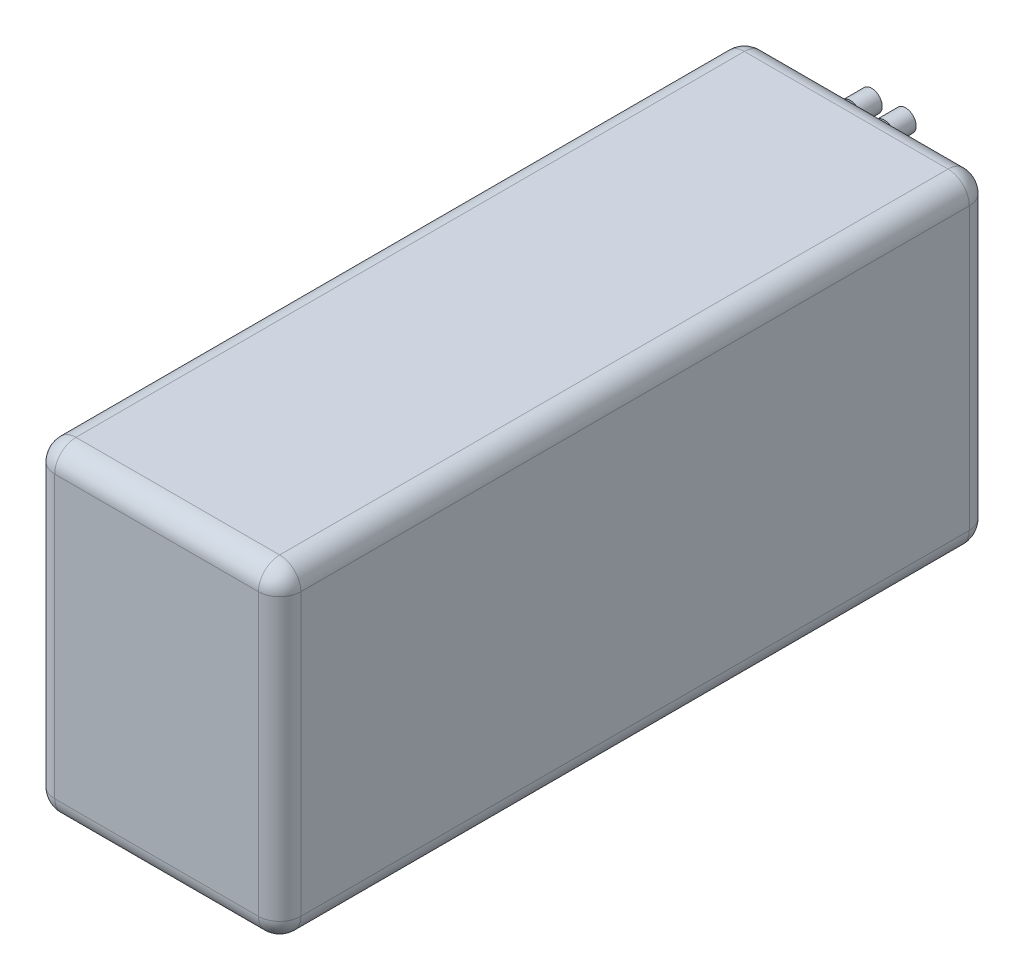
ISO-10303-21;
HEADER;
FILE_DESCRIPTION(('STEP AP214'),'2;1');
FILE_NAME('part.step','',(''),(''),'','','');
FILE_SCHEMA(('AUTOMOTIVE_DESIGN { 1 0 10303 214 1 1 1 1 }'));
ENDSEC;
DATA;
#1=APPLICATION_CONTEXT('core data for automotive mechanical design processes');
#2=APPLICATION_PROTOCOL_DEFINITION('international standard','automotive_design',2000,#1);
#3=PRODUCT_CONTEXT('',#1,'mechanical');
#4=PRODUCT('Part','Part','',(#3));
#5=PRODUCT_RELATED_PRODUCT_CATEGORY('part','',(#4));
#6=PRODUCT_DEFINITION_FORMATION('','',#4);
#7=PRODUCT_DEFINITION_CONTEXT('part definition',#1,'design');
#8=PRODUCT_DEFINITION('design','',#6,#7);
#9=PRODUCT_DEFINITION_SHAPE('','',#8);
#10=(LENGTH_UNIT() NAMED_UNIT(*) SI_UNIT(.MILLI.,.METRE.));
#11=(NAMED_UNIT(*) PLANE_ANGLE_UNIT() SI_UNIT($,.RADIAN.));
#12=(NAMED_UNIT(*) SI_UNIT($,.STERADIAN.) SOLID_ANGLE_UNIT());
#13=UNCERTAINTY_MEASURE_WITH_UNIT(LENGTH_MEASURE(1.E-05),#10,'distance_accuracy_value','');
#14=(GEOMETRIC_REPRESENTATION_CONTEXT(3) GLOBAL_UNCERTAINTY_ASSIGNED_CONTEXT((#13)) GLOBAL_UNIT_ASSIGNED_CONTEXT((#10,
#11,#12)) REPRESENTATION_CONTEXT('',''));
#15=CARTESIAN_POINT('',(0.,0.,0.));
#16=DIRECTION('',(0.,0.,1.));
#17=DIRECTION('',(1.,0.,0.));
#18=AXIS2_PLACEMENT_3D('',#15,#16,#17);
#19=CARTESIAN_POINT('',(-11.6,30.5,-33.5));
#20=DIRECTION('',(0.,0.,1.));
#21=DIRECTION('',(1.,0.,0.));
#22=AXIS2_PLACEMENT_3D('',#19,#20,#21);
#23=PLANE('',#22);
#24=CARTESIAN_POINT('',(-0.600000000000003,4.69826840522755,-33.5));
#25=DIRECTION('',(0.,0.,1.));
#26=DIRECTION('',(1.,0.,0.));
#27=AXIS2_PLACEMENT_3D('',#24,#25,#26);
#28=CIRCLE('',#27,0.5);
#29=CARTESIAN_POINT('',(-0.100000000000003,4.69826840522755,-33.5));
#30=VERTEX_POINT('',#29);
#31=EDGE_CURVE('E44',#30,#30,#28,.F.);
#32=ORIENTED_EDGE('',*,*,#31,.F.);
#33=EDGE_LOOP('',(#32));
#34=FACE_BOUND('',#33,.T.);
#35=CARTESIAN_POINT('',(0.599999999999996,4.69826840522755,-33.5));
#36=DIRECTION('',(0.,0.,1.));
#37=DIRECTION('',(1.,0.,0.));
#38=AXIS2_PLACEMENT_3D('',#35,#36,#37);
#39=CIRCLE('',#38,0.500000000000001);
#40=CARTESIAN_POINT('',(1.1,4.69826840522755,-33.5));
#41=VERTEX_POINT('',#40);
#42=EDGE_CURVE('E221',#41,#41,#39,.F.);
#43=ORIENTED_EDGE('',*,*,#42,.F.);
#44=EDGE_LOOP('',(#43));
#45=FACE_BOUND('',#44,.T.);
#46=CARTESIAN_POINT('',(-1.6,28.5,-33.5));
#47=DIRECTION('',(0.,0.,-1.));
#48=DIRECTION('',(-1.,0.,0.));
#49=AXIS2_PLACEMENT_3D('',#46,#47,#48);
#50=CIRCLE('',#49,1.);
#51=CARTESIAN_POINT('',(-0.600000000000002,28.5,-33.5));
#52=VERTEX_POINT('',#51);
#53=CARTESIAN_POINT('',(-2.6,28.5,-33.5));
#54=VERTEX_POINT('',#53);
#55=EDGE_CURVE('E144',#52,#54,#50,.T.);
#56=ORIENTED_EDGE('',*,*,#55,.F.);
#57=DIRECTION('',(-1.,0.,0.));
#58=VECTOR('',#57,1.);
#59=CARTESIAN_POINT('',(11.6,28.5,-33.5));
#60=LINE('',#59,#58);
#61=CARTESIAN_POINT('',(0.599999999999995,28.5,-33.5));
#62=VERTEX_POINT('',#61);
#63=EDGE_CURVE('E58',#52,#62,#60,.F.);
#64=ORIENTED_EDGE('',*,*,#63,.T.);
#65=CARTESIAN_POINT('',(1.6,28.5,-33.5));
#66=DIRECTION('',(0.,0.,-1.));
#67=DIRECTION('',(-1.,0.,0.));
#68=AXIS2_PLACEMENT_3D('',#65,#66,#67);
#69=CIRCLE('',#68,1.);
#70=CARTESIAN_POINT('',(2.6,28.5,-33.5));
#71=VERTEX_POINT('',#70);
#72=EDGE_CURVE('E158',#71,#62,#69,.T.);
#73=ORIENTED_EDGE('',*,*,#72,.F.);
#74=CARTESIAN_POINT('',(9.59999999999999,28.5,-33.5));
#75=VERTEX_POINT('',#74);
#76=EDGE_CURVE('E154',#71,#75,#60,.F.);
#77=ORIENTED_EDGE('',*,*,#76,.T.);
#78=DIRECTION('',(0.,-1.,0.));
#79=VECTOR('',#78,1.);
#80=CARTESIAN_POINT('',(9.59999999999999,30.5,-33.5));
#81=LINE('',#80,#79);
#82=CARTESIAN_POINT('',(9.59999999999999,2.,-33.5));
#83=VERTEX_POINT('',#82);
#84=EDGE_CURVE('E179',#75,#83,#81,.T.);
#85=ORIENTED_EDGE('',*,*,#84,.T.);
#86=DIRECTION('',(-1.,0.,0.));
#87=VECTOR('',#86,1.);
#88=CARTESIAN_POINT('',(-11.6,2.,-33.5));
#89=LINE('',#88,#87);
#90=CARTESIAN_POINT('',(-9.6,2.,-33.5));
#91=VERTEX_POINT('',#90);
#92=EDGE_CURVE('E181',#83,#91,#89,.T.);
#93=ORIENTED_EDGE('',*,*,#92,.T.);
#94=DIRECTION('',(0.,-1.,0.));
#95=VECTOR('',#94,1.);
#96=CARTESIAN_POINT('',(-9.6,30.5,-33.5));
#97=LINE('',#96,#95);
#98=CARTESIAN_POINT('',(-9.6,28.5,-33.5));
#99=VERTEX_POINT('',#98);
#100=EDGE_CURVE('E183',#91,#99,#97,.F.);
#101=ORIENTED_EDGE('',*,*,#100,.T.);
#102=EDGE_CURVE('E142',#99,#54,#60,.F.);
#103=ORIENTED_EDGE('',*,*,#102,.T.);
#104=EDGE_LOOP('',(#56,#64,#73,#77,#85,#93,#101,#103));
#105=FACE_BOUND('',#104,.T.);
#106=CARTESIAN_POINT('',(2.1,4.69826840522755,-33.5));
#107=DIRECTION('',(0.,0.,1.));
#108=DIRECTION('',(1.,0.,0.));
#109=AXIS2_PLACEMENT_3D('',#106,#107,#108);
#110=CIRCLE('',#109,0.499999999999999);
#111=CARTESIAN_POINT('',(2.6,4.69826840522755,-33.5));
#112=VERTEX_POINT('',#111);
#113=EDGE_CURVE('E288',#112,#112,#110,.F.);
#114=ORIENTED_EDGE('',*,*,#113,.F.);
#115=EDGE_LOOP('',(#114));
#116=FACE_BOUND('',#115,.T.);
#117=CARTESIAN_POINT('',(-2.1,4.69826840522755,-33.5));
#118=DIRECTION('',(0.,0.,1.));
#119=DIRECTION('',(1.,0.,0.));
#120=AXIS2_PLACEMENT_3D('',#117,#118,#119);
#121=CIRCLE('',#120,0.500000000000002);
#122=CARTESIAN_POINT('',(-1.6,4.69826840522755,-33.5));
#123=VERTEX_POINT('',#122);
#124=EDGE_CURVE('E11',#123,#123,#121,.F.);
#125=ORIENTED_EDGE('',*,*,#124,.F.);
#126=EDGE_LOOP('',(#125));
#127=FACE_BOUND('',#126,.T.);
#128=ADVANCED_FACE('F36',(#34,#45,#105,#116,#127),#23,.F.);
#129=CARTESIAN_POINT('',(11.6,30.5,-33.5));
#130=DIRECTION('',(-1.,0.,0.));
#131=DIRECTION('',(0.,0.,1.));
#132=AXIS2_PLACEMENT_3D('',#129,#130,#131);
#133=PLANE('',#132);
#134=DIRECTION('',(0.,-1.,0.));
#135=VECTOR('',#134,1.);
#136=CARTESIAN_POINT('',(11.6,30.5,-31.5));
#137=LINE('',#136,#135);
#138=CARTESIAN_POINT('',(11.6,2.,-31.5));
#139=VERTEX_POINT('',#138);
#140=CARTESIAN_POINT('',(11.6,28.5,-31.5));
#141=VERTEX_POINT('',#140);
#142=EDGE_CURVE('E207',#139,#141,#137,.F.);
#143=ORIENTED_EDGE('',*,*,#142,.T.);
#144=DIRECTION('',(0.,0.,-1.));
#145=VECTOR('',#144,1.);
#146=CARTESIAN_POINT('',(11.6,28.5,33.5));
#147=LINE('',#146,#145);
#148=CARTESIAN_POINT('',(11.6,28.5,31.5));
#149=VERTEX_POINT('',#148);
#150=EDGE_CURVE('E209',#141,#149,#147,.F.);
#151=ORIENTED_EDGE('',*,*,#150,.T.);
#152=DIRECTION('',(0.,-1.,0.));
#153=VECTOR('',#152,1.);
#154=CARTESIAN_POINT('',(11.6,30.5,31.5));
#155=LINE('',#154,#153);
#156=CARTESIAN_POINT('',(11.6,2.,31.5));
#157=VERTEX_POINT('',#156);
#158=EDGE_CURVE('E203',#149,#157,#155,.T.);
#159=ORIENTED_EDGE('',*,*,#158,.T.);
#160=DIRECTION('',(0.,0.,-1.));
#161=VECTOR('',#160,1.);
#162=CARTESIAN_POINT('',(11.6,2.,-33.5));
#163=LINE('',#162,#161);
#164=EDGE_CURVE('E205',#157,#139,#163,.T.);
#165=ORIENTED_EDGE('',*,*,#164,.T.);
#166=EDGE_LOOP('',(#143,#151,#159,#165));
#167=FACE_BOUND('',#166,.T.);
#168=ADVANCED_FACE('F297',(#167),#133,.F.);
#169=CARTESIAN_POINT('',(-11.6,30.5,-33.5));
#170=DIRECTION('',(1.,0.,0.));
#171=DIRECTION('',(0.,0.,-1.));
#172=AXIS2_PLACEMENT_3D('',#169,#170,#171);
#173=PLANE('',#172);
#174=DIRECTION('',(0.,0.,1.));
#175=VECTOR('',#174,1.);
#176=CARTESIAN_POINT('',(-11.6,28.5,-33.5));
#177=LINE('',#176,#175);
#178=CARTESIAN_POINT('',(-11.6,28.5,31.5));
#179=VERTEX_POINT('',#178);
#180=CARTESIAN_POINT('',(-11.6,28.5,-31.5));
#181=VERTEX_POINT('',#180);
#182=EDGE_CURVE('E198',#179,#181,#177,.F.);
#183=ORIENTED_EDGE('',*,*,#182,.T.);
#184=DIRECTION('',(0.,-1.,0.));
#185=VECTOR('',#184,1.);
#186=CARTESIAN_POINT('',(-11.6,30.5,-31.5));
#187=LINE('',#186,#185);
#188=CARTESIAN_POINT('',(-11.6,2.,-31.5));
#189=VERTEX_POINT('',#188);
#190=EDGE_CURVE('E200',#181,#189,#187,.T.);
#191=ORIENTED_EDGE('',*,*,#190,.T.);
#192=DIRECTION('',(0.,0.,1.));
#193=VECTOR('',#192,1.);
#194=CARTESIAN_POINT('',(-11.6,2.,-33.5));
#195=LINE('',#194,#193);
#196=CARTESIAN_POINT('',(-11.6,2.,31.5));
#197=VERTEX_POINT('',#196);
#198=EDGE_CURVE('E196',#189,#197,#195,.T.);
#199=ORIENTED_EDGE('',*,*,#198,.T.);
#200=DIRECTION('',(0.,-1.,0.));
#201=VECTOR('',#200,1.);
#202=CARTESIAN_POINT('',(-11.6,30.5,31.5));
#203=LINE('',#202,#201);
#204=EDGE_CURVE('E194',#197,#179,#203,.F.);
#205=ORIENTED_EDGE('',*,*,#204,.T.);
#206=EDGE_LOOP('',(#183,#191,#199,#205));
#207=FACE_BOUND('',#206,.T.);
#208=ADVANCED_FACE('F347',(#207),#173,.F.);
#209=CARTESIAN_POINT('',(-11.6,30.5,33.5));
#210=DIRECTION('',(0.,0.,-1.));
#211=DIRECTION('',(-1.,0.,0.));
#212=AXIS2_PLACEMENT_3D('',#209,#210,#211);
#213=PLANE('',#212);
#214=DIRECTION('',(1.,0.,0.));
#215=VECTOR('',#214,1.);
#216=CARTESIAN_POINT('',(-11.6,28.5,33.5));
#217=LINE('',#216,#215);
#218=CARTESIAN_POINT('',(9.6,28.5,33.5));
#219=VERTEX_POINT('',#218);
#220=CARTESIAN_POINT('',(-9.6,28.5,33.5));
#221=VERTEX_POINT('',#220);
#222=EDGE_CURVE('E216',#219,#221,#217,.F.);
#223=ORIENTED_EDGE('',*,*,#222,.T.);
#224=DIRECTION('',(0.,-1.,0.));
#225=VECTOR('',#224,1.);
#226=CARTESIAN_POINT('',(-9.6,30.5,33.5));
#227=LINE('',#226,#225);
#228=CARTESIAN_POINT('',(-9.6,2.,33.5));
#229=VERTEX_POINT('',#228);
#230=EDGE_CURVE('E218',#221,#229,#227,.T.);
#231=ORIENTED_EDGE('',*,*,#230,.T.);
#232=DIRECTION('',(1.,0.,0.));
#233=VECTOR('',#232,1.);
#234=CARTESIAN_POINT('',(-11.6,2.,33.5));
#235=LINE('',#234,#233);
#236=CARTESIAN_POINT('',(9.6,2.,33.5));
#237=VERTEX_POINT('',#236);
#238=EDGE_CURVE('E212',#229,#237,#235,.T.);
#239=ORIENTED_EDGE('',*,*,#238,.T.);
#240=DIRECTION('',(0.,-1.,0.));
#241=VECTOR('',#240,1.);
#242=CARTESIAN_POINT('',(9.6,30.5,33.5));
#243=LINE('',#242,#241);
#244=EDGE_CURVE('E214',#237,#219,#243,.F.);
#245=ORIENTED_EDGE('',*,*,#244,.T.);
#246=EDGE_LOOP('',(#223,#231,#239,#245));
#247=FACE_BOUND('',#246,.T.);
#248=ADVANCED_FACE('F340',(#247),#213,.F.);
#249=CARTESIAN_POINT('',(0.,30.5,0.));
#250=DIRECTION('',(0.,1.,0.));
#251=DIRECTION('',(0.,0.,1.));
#252=AXIS2_PLACEMENT_3D('',#249,#250,#251);
#253=PLANE('',#252);
#254=DIRECTION('',(0.,0.,-1.));
#255=VECTOR('',#254,1.);
#256=CARTESIAN_POINT('',(9.6,30.5,-33.5));
#257=LINE('',#256,#255);
#258=CARTESIAN_POINT('',(9.6,30.5,31.5));
#259=VERTEX_POINT('',#258);
#260=CARTESIAN_POINT('',(9.6,30.5,-31.5));
#261=VERTEX_POINT('',#260);
#262=EDGE_CURVE('E171',#259,#261,#257,.T.);
#263=ORIENTED_EDGE('',*,*,#262,.T.);
#264=DIRECTION('',(-1.,0.,0.));
#265=VECTOR('',#264,1.);
#266=CARTESIAN_POINT('',(-11.6,30.5,-31.5));
#267=LINE('',#266,#265);
#268=CARTESIAN_POINT('',(-9.6,30.5,-31.5));
#269=VERTEX_POINT('',#268);
#270=EDGE_CURVE('E176',#261,#269,#267,.T.);
#271=ORIENTED_EDGE('',*,*,#270,.T.);
#272=DIRECTION('',(0.,0.,1.));
#273=VECTOR('',#272,1.);
#274=CARTESIAN_POINT('',(-9.6,30.5,33.5));
#275=LINE('',#274,#273);
#276=CARTESIAN_POINT('',(-9.6,30.5,31.5));
#277=VERTEX_POINT('',#276);
#278=EDGE_CURVE('E174',#269,#277,#275,.T.);
#279=ORIENTED_EDGE('',*,*,#278,.T.);
#280=DIRECTION('',(1.,0.,0.));
#281=VECTOR('',#280,1.);
#282=CARTESIAN_POINT('',(11.6,30.5,31.5));
#283=LINE('',#282,#281);
#284=EDGE_CURVE('E169',#277,#259,#283,.T.);
#285=ORIENTED_EDGE('',*,*,#284,.T.);
#286=EDGE_LOOP('',(#263,#271,#279,#285));
#287=FACE_BOUND('',#286,.T.);
#288=ADVANCED_FACE('F336',(#287),#253,.T.);
#289=CARTESIAN_POINT('',(0.,0.,0.));
#290=DIRECTION('',(0.,1.,0.));
#291=DIRECTION('',(0.,0.,1.));
#292=AXIS2_PLACEMENT_3D('',#289,#290,#291);
#293=PLANE('',#292);
#294=DIRECTION('',(0.,0.,1.));
#295=VECTOR('',#294,1.);
#296=CARTESIAN_POINT('',(-9.6,0.,0.));
#297=LINE('',#296,#295);
#298=CARTESIAN_POINT('',(-9.6,0.,31.5));
#299=VERTEX_POINT('',#298);
#300=CARTESIAN_POINT('',(-9.6,0.,-31.5));
#301=VERTEX_POINT('',#300);
#302=EDGE_CURVE('E189',#299,#301,#297,.F.);
#303=ORIENTED_EDGE('',*,*,#302,.T.);
#304=DIRECTION('',(-1.,0.,0.));
#305=VECTOR('',#304,1.);
#306=CARTESIAN_POINT('',(0.,0.,-31.5));
#307=LINE('',#306,#305);
#308=CARTESIAN_POINT('',(9.6,0.,-31.5));
#309=VERTEX_POINT('',#308);
#310=EDGE_CURVE('E191',#301,#309,#307,.F.);
#311=ORIENTED_EDGE('',*,*,#310,.T.);
#312=DIRECTION('',(0.,0.,-1.));
#313=VECTOR('',#312,1.);
#314=CARTESIAN_POINT('',(9.6,0.,0.));
#315=LINE('',#314,#313);
#316=CARTESIAN_POINT('',(9.6,0.,31.5));
#317=VERTEX_POINT('',#316);
#318=EDGE_CURVE('E187',#309,#317,#315,.F.);
#319=ORIENTED_EDGE('',*,*,#318,.T.);
#320=DIRECTION('',(1.,0.,0.));
#321=VECTOR('',#320,1.);
#322=CARTESIAN_POINT('',(0.,0.,31.5));
#323=LINE('',#322,#321);
#324=EDGE_CURVE('E185',#317,#299,#323,.F.);
#325=ORIENTED_EDGE('',*,*,#324,.T.);
#326=EDGE_LOOP('',(#303,#311,#319,#325));
#327=FACE_BOUND('',#326,.T.);
#328=ADVANCED_FACE('F339',(#327),#293,.F.);
#329=CARTESIAN_POINT('',(-11.6,2.,31.5));
#330=DIRECTION('',(1.,0.,0.));
#331=DIRECTION('',(0.,0.,-1.));
#332=AXIS2_PLACEMENT_3D('',#329,#330,#331);
#333=CYLINDRICAL_SURFACE('',#332,2.);
#334=CARTESIAN_POINT('',(9.6,2.,31.5));
#335=DIRECTION('',(1.,0.,0.));
#336=DIRECTION('',(0.,0.,-1.));
#337=AXIS2_PLACEMENT_3D('',#334,#335,#336);
#338=CIRCLE('',#337,2.);
#339=EDGE_CURVE('E172',#237,#317,#338,.T.);
#340=ORIENTED_EDGE('',*,*,#339,.F.);
#341=ORIENTED_EDGE('',*,*,#238,.F.);
#342=CARTESIAN_POINT('',(-9.6,2.,31.5));
#343=DIRECTION('',(-1.,0.,0.));
#344=DIRECTION('',(0.,0.,1.));
#345=AXIS2_PLACEMENT_3D('',#342,#343,#344);
#346=CIRCLE('',#345,2.);
#347=EDGE_CURVE('E281',#299,#229,#346,.T.);
#348=ORIENTED_EDGE('',*,*,#347,.F.);
#349=ORIENTED_EDGE('',*,*,#324,.F.);
#350=EDGE_LOOP('',(#340,#341,#348,#349));
#351=FACE_BOUND('',#350,.T.);
#352=ADVANCED_FACE('F38',(#351),#333,.T.);
#353=CARTESIAN_POINT('',(9.6,2.,31.5));
#354=DIRECTION('',(0.,0.,1.));
#355=DIRECTION('',(1.,0.,0.));
#356=AXIS2_PLACEMENT_3D('',#353,#354,#355);
#357=SPHERICAL_SURFACE('',#356,2.);
#358=CARTESIAN_POINT('',(9.6,2.,31.5));
#359=DIRECTION('',(0.,-1.,0.));
#360=DIRECTION('',(0.,0.,-1.));
#361=AXIS2_PLACEMENT_3D('',#358,#359,#360);
#362=CIRCLE('',#361,2.);
#363=EDGE_CURVE('E275',#237,#157,#362,.F.);
#364=ORIENTED_EDGE('',*,*,#363,.F.);
#365=ORIENTED_EDGE('',*,*,#339,.T.);
#366=CARTESIAN_POINT('',(9.6,2.,31.5));
#367=DIRECTION('',(0.,0.,1.));
#368=DIRECTION('',(1.,0.,0.));
#369=AXIS2_PLACEMENT_3D('',#366,#367,#368);
#370=CIRCLE('',#369,2.);
#371=EDGE_CURVE('E278',#157,#317,#370,.F.);
#372=ORIENTED_EDGE('',*,*,#371,.F.);
#373=EDGE_LOOP('',(#364,#365,#372));
#374=FACE_BOUND('',#373,.T.);
#375=ADVANCED_FACE('F423',(#374),#357,.T.);
#376=CARTESIAN_POINT('',(-9.6,2.,31.5));
#377=DIRECTION('',(0.,0.,1.));
#378=DIRECTION('',(1.,0.,0.));
#379=AXIS2_PLACEMENT_3D('',#376,#377,#378);
#380=SPHERICAL_SURFACE('',#379,2.);
#381=CARTESIAN_POINT('',(-9.6,2.,31.5));
#382=DIRECTION('',(0.,0.,1.));
#383=DIRECTION('',(1.,0.,0.));
#384=AXIS2_PLACEMENT_3D('',#381,#382,#383);
#385=CIRCLE('',#384,2.);
#386=EDGE_CURVE('E270',#299,#197,#385,.F.);
#387=ORIENTED_EDGE('',*,*,#386,.F.);
#388=ORIENTED_EDGE('',*,*,#347,.T.);
#389=CARTESIAN_POINT('',(-9.6,2.,31.5));
#390=DIRECTION('',(0.,-1.,0.));
#391=DIRECTION('',(0.,0.,-1.));
#392=AXIS2_PLACEMENT_3D('',#389,#390,#391);
#393=CIRCLE('',#392,2.);
#394=EDGE_CURVE('E273',#197,#229,#393,.F.);
#395=ORIENTED_EDGE('',*,*,#394,.F.);
#396=EDGE_LOOP('',(#387,#388,#395));
#397=FACE_BOUND('',#396,.T.);
#398=ADVANCED_FACE('F420',(#397),#380,.T.);
#399=CARTESIAN_POINT('',(9.6,2.,-33.5));
#400=DIRECTION('',(0.,0.,-1.));
#401=DIRECTION('',(-1.,0.,0.));
#402=AXIS2_PLACEMENT_3D('',#399,#400,#401);
#403=CYLINDRICAL_SURFACE('',#402,2.);
#404=ORIENTED_EDGE('',*,*,#371,.T.);
#405=ORIENTED_EDGE('',*,*,#318,.F.);
#406=CARTESIAN_POINT('',(9.6,2.,-31.5));
#407=DIRECTION('',(0.,0.,-1.));
#408=DIRECTION('',(-1.,0.,0.));
#409=AXIS2_PLACEMENT_3D('',#406,#407,#408);
#410=CIRCLE('',#409,2.);
#411=EDGE_CURVE('E265',#139,#309,#410,.T.);
#412=ORIENTED_EDGE('',*,*,#411,.F.);
#413=ORIENTED_EDGE('',*,*,#164,.F.);
#414=EDGE_LOOP('',(#404,#405,#412,#413));
#415=FACE_BOUND('',#414,.T.);
#416=ADVANCED_FACE('F416',(#415),#403,.T.);
#417=CARTESIAN_POINT('',(9.6,30.5,31.5));
#418=DIRECTION('',(0.,-1.,0.));
#419=DIRECTION('',(0.,0.,-1.));
#420=AXIS2_PLACEMENT_3D('',#417,#418,#419);
#421=CYLINDRICAL_SURFACE('',#420,2.);
#422=ORIENTED_EDGE('',*,*,#363,.T.);
#423=ORIENTED_EDGE('',*,*,#158,.F.);
#424=CARTESIAN_POINT('',(9.6,28.5,31.5));
#425=DIRECTION('',(0.,1.,0.));
#426=DIRECTION('',(0.,0.,1.));
#427=AXIS2_PLACEMENT_3D('',#424,#425,#426);
#428=CIRCLE('',#427,2.);
#429=EDGE_CURVE('E262',#219,#149,#428,.T.);
#430=ORIENTED_EDGE('',*,*,#429,.F.);
#431=ORIENTED_EDGE('',*,*,#244,.F.);
#432=EDGE_LOOP('',(#422,#423,#430,#431));
#433=FACE_BOUND('',#432,.T.);
#434=ADVANCED_FACE('F412',(#433),#421,.T.);
#435=CARTESIAN_POINT('',(0.,28.5,31.5));
#436=DIRECTION('',(-1.,0.,0.));
#437=DIRECTION('',(0.,0.,1.));
#438=AXIS2_PLACEMENT_3D('',#435,#436,#437);
#439=CYLINDRICAL_SURFACE('',#438,2.);
#440=CARTESIAN_POINT('',(-9.6,28.5,31.5));
#441=DIRECTION('',(-1.,0.,0.));
#442=DIRECTION('',(0.,0.,1.));
#443=AXIS2_PLACEMENT_3D('',#440,#441,#442);
#444=CIRCLE('',#443,2.);
#445=EDGE_CURVE('E256',#221,#277,#444,.T.);
#446=ORIENTED_EDGE('',*,*,#445,.F.);
#447=ORIENTED_EDGE('',*,*,#222,.F.);
#448=CARTESIAN_POINT('',(9.6,28.5,31.5));
#449=DIRECTION('',(1.,0.,0.));
#450=DIRECTION('',(0.,0.,-1.));
#451=AXIS2_PLACEMENT_3D('',#448,#449,#450);
#452=CIRCLE('',#451,2.);
#453=EDGE_CURVE('E259',#259,#219,#452,.T.);
#454=ORIENTED_EDGE('',*,*,#453,.F.);
#455=ORIENTED_EDGE('',*,*,#284,.F.);
#456=EDGE_LOOP('',(#446,#447,#454,#455));
#457=FACE_BOUND('',#456,.T.);
#458=ADVANCED_FACE('F408',(#457),#439,.T.);
#459=CARTESIAN_POINT('',(-9.6,30.5,31.5));
#460=DIRECTION('',(0.,-1.,0.));
#461=DIRECTION('',(0.,0.,-1.));
#462=AXIS2_PLACEMENT_3D('',#459,#460,#461);
#463=CYLINDRICAL_SURFACE('',#462,2.);
#464=ORIENTED_EDGE('',*,*,#394,.T.);
#465=ORIENTED_EDGE('',*,*,#230,.F.);
#466=CARTESIAN_POINT('',(-9.6,28.5,31.5));
#467=DIRECTION('',(0.,1.,0.));
#468=DIRECTION('',(0.,0.,1.));
#469=AXIS2_PLACEMENT_3D('',#466,#467,#468);
#470=CIRCLE('',#469,2.);
#471=EDGE_CURVE('E253',#179,#221,#470,.T.);
#472=ORIENTED_EDGE('',*,*,#471,.F.);
#473=ORIENTED_EDGE('',*,*,#204,.F.);
#474=EDGE_LOOP('',(#464,#465,#472,#473));
#475=FACE_BOUND('',#474,.T.);
#476=ADVANCED_FACE('F404',(#475),#463,.T.);
#477=CARTESIAN_POINT('',(-9.6,2.,-33.5));
#478=DIRECTION('',(0.,0.,1.));
#479=DIRECTION('',(1.,0.,0.));
#480=AXIS2_PLACEMENT_3D('',#477,#478,#479);
#481=CYLINDRICAL_SURFACE('',#480,2.);
#482=ORIENTED_EDGE('',*,*,#386,.T.);
#483=ORIENTED_EDGE('',*,*,#198,.F.);
#484=CARTESIAN_POINT('',(-9.6,2.,-31.5));
#485=DIRECTION('',(0.,0.,-1.));
#486=DIRECTION('',(-1.,0.,0.));
#487=AXIS2_PLACEMENT_3D('',#484,#485,#486);
#488=CIRCLE('',#487,2.);
#489=EDGE_CURVE('E250',#301,#189,#488,.T.);
#490=ORIENTED_EDGE('',*,*,#489,.F.);
#491=ORIENTED_EDGE('',*,*,#302,.F.);
#492=EDGE_LOOP('',(#482,#483,#490,#491));
#493=FACE_BOUND('',#492,.T.);
#494=ADVANCED_FACE('F400',(#493),#481,.T.);
#495=CARTESIAN_POINT('',(-11.6,2.,-31.5));
#496=DIRECTION('',(-1.,0.,0.));
#497=DIRECTION('',(0.,0.,1.));
#498=AXIS2_PLACEMENT_3D('',#495,#496,#497);
#499=CYLINDRICAL_SURFACE('',#498,2.);
#500=CARTESIAN_POINT('',(9.6,2.,-31.5));
#501=DIRECTION('',(1.,0.,0.));
#502=DIRECTION('',(0.,0.,-1.));
#503=AXIS2_PLACEMENT_3D('',#500,#501,#502);
#504=CIRCLE('',#503,2.);
#505=EDGE_CURVE('E267',#309,#83,#504,.T.);
#506=ORIENTED_EDGE('',*,*,#505,.F.);
#507=ORIENTED_EDGE('',*,*,#310,.F.);
#508=CARTESIAN_POINT('',(-9.6,2.,-31.5));
#509=DIRECTION('',(-1.,0.,0.));
#510=DIRECTION('',(0.,0.,1.));
#511=AXIS2_PLACEMENT_3D('',#508,#509,#510);
#512=CIRCLE('',#511,2.);
#513=EDGE_CURVE('E247',#91,#301,#512,.T.);
#514=ORIENTED_EDGE('',*,*,#513,.F.);
#515=ORIENTED_EDGE('',*,*,#92,.F.);
#516=EDGE_LOOP('',(#506,#507,#514,#515));
#517=FACE_BOUND('',#516,.T.);
#518=ADVANCED_FACE('F396',(#517),#499,.T.);
#519=CARTESIAN_POINT('',(9.6,2.,-31.5));
#520=DIRECTION('',(0.,0.,1.));
#521=DIRECTION('',(1.,0.,0.));
#522=AXIS2_PLACEMENT_3D('',#519,#520,#521);
#523=SPHERICAL_SURFACE('',#522,2.);
#524=ORIENTED_EDGE('',*,*,#411,.T.);
#525=ORIENTED_EDGE('',*,*,#505,.T.);
#526=CARTESIAN_POINT('',(9.59999999999999,2.,-31.5));
#527=DIRECTION('',(0.,-1.,0.));
#528=DIRECTION('',(0.,0.,-1.));
#529=AXIS2_PLACEMENT_3D('',#526,#527,#528);
#530=CIRCLE('',#529,2.);
#531=EDGE_CURVE('E244',#139,#83,#530,.F.);
#532=ORIENTED_EDGE('',*,*,#531,.F.);
#533=EDGE_LOOP('',(#524,#525,#532));
#534=FACE_BOUND('',#533,.T.);
#535=ADVANCED_FACE('F392',(#534),#523,.T.);
#536=CARTESIAN_POINT('',(9.6,28.5,31.5));
#537=DIRECTION('',(0.,0.,1.));
#538=DIRECTION('',(1.,0.,0.));
#539=AXIS2_PLACEMENT_3D('',#536,#537,#538);
#540=SPHERICAL_SURFACE('',#539,2.);
#541=ORIENTED_EDGE('',*,*,#453,.T.);
#542=ORIENTED_EDGE('',*,*,#429,.T.);
#543=CARTESIAN_POINT('',(9.6,28.5,31.5));
#544=DIRECTION('',(0.,0.,1.));
#545=DIRECTION('',(0.,-1.,0.));
#546=AXIS2_PLACEMENT_3D('',#543,#544,#545);
#547=CIRCLE('',#546,2.);
#548=EDGE_CURVE('E242',#259,#149,#547,.F.);
#549=ORIENTED_EDGE('',*,*,#548,.F.);
#550=EDGE_LOOP('',(#541,#542,#549));
#551=FACE_BOUND('',#550,.T.);
#552=ADVANCED_FACE('F388',(#551),#540,.T.);
#553=CARTESIAN_POINT('',(-9.6,28.5,31.5));
#554=DIRECTION('',(0.,0.,1.));
#555=DIRECTION('',(1.,0.,0.));
#556=AXIS2_PLACEMENT_3D('',#553,#554,#555);
#557=SPHERICAL_SURFACE('',#556,2.);
#558=ORIENTED_EDGE('',*,*,#471,.T.);
#559=ORIENTED_EDGE('',*,*,#445,.T.);
#560=CARTESIAN_POINT('',(-9.6,28.5,31.5));
#561=DIRECTION('',(0.,0.,1.));
#562=DIRECTION('',(1.,0.,0.));
#563=AXIS2_PLACEMENT_3D('',#560,#561,#562);
#564=CIRCLE('',#563,2.);
#565=EDGE_CURVE('E239',#179,#277,#564,.F.);
#566=ORIENTED_EDGE('',*,*,#565,.F.);
#567=EDGE_LOOP('',(#558,#559,#566));
#568=FACE_BOUND('',#567,.T.);
#569=ADVANCED_FACE('F384',(#568),#557,.T.);
#570=CARTESIAN_POINT('',(-9.6,2.,-31.5));
#571=DIRECTION('',(0.,0.,1.));
#572=DIRECTION('',(1.,0.,0.));
#573=AXIS2_PLACEMENT_3D('',#570,#571,#572);
#574=SPHERICAL_SURFACE('',#573,2.);
#575=ORIENTED_EDGE('',*,*,#513,.T.);
#576=ORIENTED_EDGE('',*,*,#489,.T.);
#577=CARTESIAN_POINT('',(-9.6,2.,-31.5));
#578=DIRECTION('',(0.,-1.,0.));
#579=DIRECTION('',(0.,0.,-1.));
#580=AXIS2_PLACEMENT_3D('',#577,#578,#579);
#581=CIRCLE('',#580,2.);
#582=EDGE_CURVE('E237',#91,#189,#581,.F.);
#583=ORIENTED_EDGE('',*,*,#582,.F.);
#584=EDGE_LOOP('',(#575,#576,#583));
#585=FACE_BOUND('',#584,.T.);
#586=ADVANCED_FACE('F380',(#585),#574,.T.);
#587=CARTESIAN_POINT('',(9.59999999999999,30.5,-31.5));
#588=DIRECTION('',(0.,-1.,0.));
#589=DIRECTION('',(0.,0.,-1.));
#590=AXIS2_PLACEMENT_3D('',#587,#588,#589);
#591=CYLINDRICAL_SURFACE('',#590,2.);
#592=ORIENTED_EDGE('',*,*,#531,.T.);
#593=ORIENTED_EDGE('',*,*,#84,.F.);
#594=CARTESIAN_POINT('',(9.6,28.5,-31.5));
#595=DIRECTION('',(0.,1.,0.));
#596=DIRECTION('',(0.,0.,1.));
#597=AXIS2_PLACEMENT_3D('',#594,#595,#596);
#598=CIRCLE('',#597,2.);
#599=EDGE_CURVE('E234',#141,#75,#598,.T.);
#600=ORIENTED_EDGE('',*,*,#599,.F.);
#601=ORIENTED_EDGE('',*,*,#142,.F.);
#602=EDGE_LOOP('',(#592,#593,#600,#601));
#603=FACE_BOUND('',#602,.T.);
#604=ADVANCED_FACE('F376',(#603),#591,.T.);
#605=CARTESIAN_POINT('',(9.6,28.5,0.));
#606=DIRECTION('',(0.,0.,1.));
#607=DIRECTION('',(1.,0.,0.));
#608=AXIS2_PLACEMENT_3D('',#605,#606,#607);
#609=CYLINDRICAL_SURFACE('',#608,2.);
#610=ORIENTED_EDGE('',*,*,#548,.T.);
#611=ORIENTED_EDGE('',*,*,#150,.F.);
#612=CARTESIAN_POINT('',(9.6,28.5,-31.5));
#613=DIRECTION('',(0.,0.,-1.));
#614=DIRECTION('',(-1.,0.,0.));
#615=AXIS2_PLACEMENT_3D('',#612,#613,#614);
#616=CIRCLE('',#615,2.);
#617=EDGE_CURVE('E231',#261,#141,#616,.T.);
#618=ORIENTED_EDGE('',*,*,#617,.F.);
#619=ORIENTED_EDGE('',*,*,#262,.F.);
#620=EDGE_LOOP('',(#610,#611,#618,#619));
#621=FACE_BOUND('',#620,.T.);
#622=ADVANCED_FACE('F372',(#621),#609,.T.);
#623=CARTESIAN_POINT('',(-9.6,28.5,0.));
#624=DIRECTION('',(0.,0.,-1.));
#625=DIRECTION('',(-1.,0.,0.));
#626=AXIS2_PLACEMENT_3D('',#623,#624,#625);
#627=CYLINDRICAL_SURFACE('',#626,2.);
#628=ORIENTED_EDGE('',*,*,#565,.T.);
#629=ORIENTED_EDGE('',*,*,#278,.F.);
#630=CARTESIAN_POINT('',(-9.6,28.5,-31.5));
#631=DIRECTION('',(0.,0.,-1.));
#632=DIRECTION('',(-1.,0.,0.));
#633=AXIS2_PLACEMENT_3D('',#630,#631,#632);
#634=CIRCLE('',#633,2.);
#635=EDGE_CURVE('E228',#181,#269,#634,.T.);
#636=ORIENTED_EDGE('',*,*,#635,.F.);
#637=ORIENTED_EDGE('',*,*,#182,.F.);
#638=EDGE_LOOP('',(#628,#629,#636,#637));
#639=FACE_BOUND('',#638,.T.);
#640=ADVANCED_FACE('F368',(#639),#627,.T.);
#641=CARTESIAN_POINT('',(-9.6,30.5,-31.5));
#642=DIRECTION('',(0.,-1.,0.));
#643=DIRECTION('',(0.,0.,-1.));
#644=AXIS2_PLACEMENT_3D('',#641,#642,#643);
#645=CYLINDRICAL_SURFACE('',#644,2.);
#646=ORIENTED_EDGE('',*,*,#582,.T.);
#647=ORIENTED_EDGE('',*,*,#190,.F.);
#648=CARTESIAN_POINT('',(-9.6,28.5,-31.5));
#649=DIRECTION('',(0.,1.,0.));
#650=DIRECTION('',(0.,0.,1.));
#651=AXIS2_PLACEMENT_3D('',#648,#649,#650);
#652=CIRCLE('',#651,2.);
#653=EDGE_CURVE('E225',#99,#181,#652,.T.);
#654=ORIENTED_EDGE('',*,*,#653,.F.);
#655=ORIENTED_EDGE('',*,*,#100,.F.);
#656=EDGE_LOOP('',(#646,#647,#654,#655));
#657=FACE_BOUND('',#656,.T.);
#658=ADVANCED_FACE('F364',(#657),#645,.T.);
#659=CARTESIAN_POINT('',(9.6,28.5,-31.5));
#660=DIRECTION('',(0.,0.,1.));
#661=DIRECTION('',(1.,0.,0.));
#662=AXIS2_PLACEMENT_3D('',#659,#660,#661);
#663=SPHERICAL_SURFACE('',#662,2.);
#664=ORIENTED_EDGE('',*,*,#617,.T.);
#665=ORIENTED_EDGE('',*,*,#599,.T.);
#666=CARTESIAN_POINT('',(9.59999999999999,28.5,-31.5));
#667=DIRECTION('',(1.,0.,0.));
#668=DIRECTION('',(0.,1.,0.));
#669=AXIS2_PLACEMENT_3D('',#666,#667,#668);
#670=CIRCLE('',#669,2.);
#671=EDGE_CURVE('E223',#261,#75,#670,.F.);
#672=ORIENTED_EDGE('',*,*,#671,.F.);
#673=EDGE_LOOP('',(#664,#665,#672));
#674=FACE_BOUND('',#673,.T.);
#675=ADVANCED_FACE('F360',(#674),#663,.T.);
#676=CARTESIAN_POINT('',(-9.6,28.5,-31.5));
#677=DIRECTION('',(0.,0.,1.));
#678=DIRECTION('',(1.,0.,0.));
#679=AXIS2_PLACEMENT_3D('',#676,#677,#678);
#680=SPHERICAL_SURFACE('',#679,2.);
#681=ORIENTED_EDGE('',*,*,#653,.T.);
#682=ORIENTED_EDGE('',*,*,#635,.T.);
#683=CARTESIAN_POINT('',(-9.6,28.5,-31.5));
#684=DIRECTION('',(-1.,0.,0.));
#685=DIRECTION('',(0.,0.,1.));
#686=AXIS2_PLACEMENT_3D('',#683,#684,#685);
#687=CIRCLE('',#686,2.);
#688=EDGE_CURVE('E165',#99,#269,#687,.F.);
#689=ORIENTED_EDGE('',*,*,#688,.F.);
#690=EDGE_LOOP('',(#681,#682,#689));
#691=FACE_BOUND('',#690,.T.);
#692=ADVANCED_FACE('F357',(#691),#680,.T.);
#693=CARTESIAN_POINT('',(0.,28.5,-31.5));
#694=DIRECTION('',(1.,0.,0.));
#695=DIRECTION('',(0.,0.,-1.));
#696=AXIS2_PLACEMENT_3D('',#693,#694,#695);
#697=CYLINDRICAL_SURFACE('',#696,2.);
#698=ORIENTED_EDGE('',*,*,#671,.T.);
#699=ORIENTED_EDGE('',*,*,#76,.F.);
#700=EDGE_CURVE('E139',#62,#71,#60,.F.);
#701=ORIENTED_EDGE('',*,*,#700,.F.);
#702=ORIENTED_EDGE('',*,*,#63,.F.);
#703=EDGE_CURVE('E51',#54,#52,#60,.F.);
#704=ORIENTED_EDGE('',*,*,#703,.F.);
#705=ORIENTED_EDGE('',*,*,#102,.F.);
#706=ORIENTED_EDGE('',*,*,#688,.T.);
#707=ORIENTED_EDGE('',*,*,#270,.F.);
#708=EDGE_LOOP('',(#698,#699,#701,#702,#704,#705,#706,#707));
#709=FACE_BOUND('',#708,.T.);
#710=ADVANCED_FACE('F137',(#709),#697,.T.);
#711=CARTESIAN_POINT('',(1.6,28.5,-35.5));
#712=DIRECTION('',(0.,0.,1.));
#713=DIRECTION('',(1.,0.,0.));
#714=AXIS2_PLACEMENT_3D('',#711,#712,#713);
#715=CYLINDRICAL_SURFACE('',#714,1.);
#716=CARTESIAN_POINT('',(1.6,28.5,-35.5));
#717=DIRECTION('',(0.,0.,-1.));
#718=DIRECTION('',(-1.,0.,0.));
#719=AXIS2_PLACEMENT_3D('',#716,#717,#718);
#720=CIRCLE('',#719,1.);
#721=CARTESIAN_POINT('',(0.599999999999995,28.5,-35.5));
#722=VERTEX_POINT('',#721);
#723=EDGE_CURVE('E162',#722,#722,#720,.T.);
#724=ORIENTED_EDGE('',*,*,#723,.F.);
#725=EDGE_LOOP('',(#724));
#726=FACE_BOUND('',#725,.T.);
#727=EDGE_CURVE('E166',#62,#71,#69,.T.);
#728=ORIENTED_EDGE('',*,*,#727,.T.);
#729=ORIENTED_EDGE('',*,*,#72,.T.);
#730=EDGE_LOOP('',(#728,#729));
#731=FACE_BOUND('',#730,.T.);
#732=ADVANCED_FACE('F328',(#726,#731),#715,.T.);
#733=CARTESIAN_POINT('',(1.6,28.5,-35.5));
#734=DIRECTION('',(0.,0.,-1.));
#735=DIRECTION('',(-1.,0.,0.));
#736=AXIS2_PLACEMENT_3D('',#733,#734,#735);
#737=PLANE('',#736);
#738=ORIENTED_EDGE('',*,*,#723,.T.);
#739=EDGE_LOOP('',(#738));
#740=FACE_BOUND('',#739,.T.);
#741=ADVANCED_FACE('F325',(#740),#737,.T.);
#742=CARTESIAN_POINT('',(1.6,28.5,-33.5));
#743=DIRECTION('',(0.,0.,-1.));
#744=DIRECTION('',(-1.,0.,0.));
#745=AXIS2_PLACEMENT_3D('',#742,#743,#744);
#746=PLANE('',#745);
#747=ORIENTED_EDGE('',*,*,#700,.T.);
#748=ORIENTED_EDGE('',*,*,#727,.F.);
#749=EDGE_LOOP('',(#747,#748));
#750=FACE_BOUND('',#749,.T.);
#751=ADVANCED_FACE('F323',(#750),#746,.F.);
#752=CARTESIAN_POINT('',(-1.6,28.5,-35.5));
#753=DIRECTION('',(0.,0.,1.));
#754=DIRECTION('',(1.,0.,0.));
#755=AXIS2_PLACEMENT_3D('',#752,#753,#754);
#756=CYLINDRICAL_SURFACE('',#755,1.);
#757=CARTESIAN_POINT('',(-1.6,28.5,-35.5));
#758=DIRECTION('',(0.,0.,-1.));
#759=DIRECTION('',(-1.,0.,0.));
#760=AXIS2_PLACEMENT_3D('',#757,#758,#759);
#761=CIRCLE('',#760,1.);
#762=CARTESIAN_POINT('',(-2.6,28.5,-35.5));
#763=VERTEX_POINT('',#762);
#764=EDGE_CURVE('E156',#763,#763,#761,.T.);
#765=ORIENTED_EDGE('',*,*,#764,.F.);
#766=EDGE_LOOP('',(#765));
#767=FACE_BOUND('',#766,.T.);
#768=EDGE_CURVE('E149',#54,#52,#50,.T.);
#769=ORIENTED_EDGE('',*,*,#768,.T.);
#770=ORIENTED_EDGE('',*,*,#55,.T.);
#771=EDGE_LOOP('',(#769,#770));
#772=FACE_BOUND('',#771,.T.);
#773=ADVANCED_FACE('F155',(#767,#772),#756,.T.);
#774=CARTESIAN_POINT('',(-1.6,28.5,-35.5));
#775=DIRECTION('',(0.,0.,-1.));
#776=DIRECTION('',(-1.,0.,0.));
#777=AXIS2_PLACEMENT_3D('',#774,#775,#776);
#778=PLANE('',#777);
#779=ORIENTED_EDGE('',*,*,#764,.T.);
#780=EDGE_LOOP('',(#779));
#781=FACE_BOUND('',#780,.T.);
#782=ADVANCED_FACE('F313',(#781),#778,.T.);
#783=CARTESIAN_POINT('',(-1.6,28.5,-33.5));
#784=DIRECTION('',(0.,0.,-1.));
#785=DIRECTION('',(-1.,0.,0.));
#786=AXIS2_PLACEMENT_3D('',#783,#784,#785);
#787=PLANE('',#786);
#788=ORIENTED_EDGE('',*,*,#703,.T.);
#789=ORIENTED_EDGE('',*,*,#768,.F.);
#790=EDGE_LOOP('',(#788,#789));
#791=FACE_BOUND('',#790,.T.);
#792=ADVANCED_FACE('F153',(#791),#787,.F.);
#793=CARTESIAN_POINT('',(0.599999999999996,4.69826840522755,-35.5));
#794=DIRECTION('',(0.,0.,1.));
#795=DIRECTION('',(1.,0.,0.));
#796=AXIS2_PLACEMENT_3D('',#793,#794,#795);
#797=CYLINDRICAL_SURFACE('',#796,0.500000000000001);
#798=CARTESIAN_POINT('',(0.599999999999996,4.69826840522755,-35.5));
#799=DIRECTION('',(0.,0.,-1.));
#800=DIRECTION('',(-1.,0.,0.));
#801=AXIS2_PLACEMENT_3D('',#798,#799,#800);
#802=CIRCLE('',#801,0.500000000000001);
#803=CARTESIAN_POINT('',(0.0999999999999954,4.69826840522755,-35.5));
#804=VERTEX_POINT('',#803);
#805=EDGE_CURVE('E150',#804,#804,#802,.T.);
#806=ORIENTED_EDGE('',*,*,#805,.F.);
#807=EDGE_LOOP('',(#806));
#808=FACE_BOUND('',#807,.T.);
#809=ORIENTED_EDGE('',*,*,#42,.T.);
#810=EDGE_LOOP('',(#809));
#811=FACE_BOUND('',#810,.T.);
#812=ADVANCED_FACE('F301',(#808,#811),#797,.T.);
#813=CARTESIAN_POINT('',(0.599999999999996,4.69826840522755,-35.5));
#814=DIRECTION('',(0.,0.,-1.));
#815=DIRECTION('',(-1.,0.,0.));
#816=AXIS2_PLACEMENT_3D('',#813,#814,#815);
#817=PLANE('',#816);
#818=ORIENTED_EDGE('',*,*,#805,.T.);
#819=EDGE_LOOP('',(#818));
#820=FACE_BOUND('',#819,.T.);
#821=ADVANCED_FACE('F303',(#820),#817,.T.);
#822=CARTESIAN_POINT('',(2.1,4.69826840522755,-35.5));
#823=DIRECTION('',(0.,0.,1.));
#824=DIRECTION('',(1.,0.,0.));
#825=AXIS2_PLACEMENT_3D('',#822,#823,#824);
#826=CYLINDRICAL_SURFACE('',#825,0.499999999999999);
#827=CARTESIAN_POINT('',(2.1,4.69826840522755,-35.5));
#828=DIRECTION('',(0.,0.,-1.));
#829=DIRECTION('',(-1.,0.,0.));
#830=AXIS2_PLACEMENT_3D('',#827,#828,#829);
#831=CIRCLE('',#830,0.499999999999999);
#832=CARTESIAN_POINT('',(1.6,4.69826840522755,-35.5));
#833=VERTEX_POINT('',#832);
#834=EDGE_CURVE('E766',#833,#833,#831,.T.);
#835=ORIENTED_EDGE('',*,*,#834,.F.);
#836=EDGE_LOOP('',(#835));
#837=FACE_BOUND('',#836,.T.);
#838=ORIENTED_EDGE('',*,*,#113,.T.);
#839=EDGE_LOOP('',(#838));
#840=FACE_BOUND('',#839,.T.);
#841=ADVANCED_FACE('F310',(#837,#840),#826,.T.);
#842=CARTESIAN_POINT('',(2.1,4.69826840522755,-35.5));
#843=DIRECTION('',(0.,0.,-1.));
#844=DIRECTION('',(-1.,0.,0.));
#845=AXIS2_PLACEMENT_3D('',#842,#843,#844);
#846=PLANE('',#845);
#847=ORIENTED_EDGE('',*,*,#834,.T.);
#848=EDGE_LOOP('',(#847));
#849=FACE_BOUND('',#848,.T.);
#850=ADVANCED_FACE('F511',(#849),#846,.T.);
#851=CARTESIAN_POINT('',(-0.600000000000003,4.69826840522755,-35.5));
#852=DIRECTION('',(0.,0.,1.));
#853=DIRECTION('',(1.,0.,0.));
#854=AXIS2_PLACEMENT_3D('',#851,#852,#853);
#855=CYLINDRICAL_SURFACE('',#854,0.5);
#856=CARTESIAN_POINT('',(-0.600000000000003,4.69826840522755,-35.5));
#857=DIRECTION('',(0.,0.,-1.));
#858=DIRECTION('',(-1.,0.,0.));
#859=AXIS2_PLACEMENT_3D('',#856,#857,#858);
#860=CIRCLE('',#859,0.5);
#861=CARTESIAN_POINT('',(-1.1,4.69826840522755,-35.5));
#862=VERTEX_POINT('',#861);
#863=EDGE_CURVE('E765',#862,#862,#860,.T.);
#864=ORIENTED_EDGE('',*,*,#863,.F.);
#865=EDGE_LOOP('',(#864));
#866=FACE_BOUND('',#865,.T.);
#867=ORIENTED_EDGE('',*,*,#31,.T.);
#868=EDGE_LOOP('',(#867));
#869=FACE_BOUND('',#868,.T.);
#870=ADVANCED_FACE('F293',(#866,#869),#855,.T.);
#871=CARTESIAN_POINT('',(-0.600000000000003,4.69826840522755,-35.5));
#872=DIRECTION('',(0.,0.,-1.));
#873=DIRECTION('',(-1.,0.,0.));
#874=AXIS2_PLACEMENT_3D('',#871,#872,#873);
#875=PLANE('',#874);
#876=ORIENTED_EDGE('',*,*,#863,.T.);
#877=EDGE_LOOP('',(#876));
#878=FACE_BOUND('',#877,.T.);
#879=ADVANCED_FACE('F548',(#878),#875,.T.);
#880=CARTESIAN_POINT('',(-2.1,4.69826840522755,-35.5));
#881=DIRECTION('',(0.,0.,1.));
#882=DIRECTION('',(1.,0.,0.));
#883=AXIS2_PLACEMENT_3D('',#880,#881,#882);
#884=CYLINDRICAL_SURFACE('',#883,0.500000000000002);
#885=CARTESIAN_POINT('',(-2.1,4.69826840522755,-35.5));
#886=DIRECTION('',(0.,0.,-1.));
#887=DIRECTION('',(-1.,0.,0.));
#888=AXIS2_PLACEMENT_3D('',#885,#886,#887);
#889=CIRCLE('',#888,0.500000000000002);
#890=CARTESIAN_POINT('',(-2.6,4.69826840522755,-35.5));
#891=VERTEX_POINT('',#890);
#892=EDGE_CURVE('E767',#891,#891,#889,.T.);
#893=ORIENTED_EDGE('',*,*,#892,.F.);
#894=EDGE_LOOP('',(#893));
#895=FACE_BOUND('',#894,.T.);
#896=ORIENTED_EDGE('',*,*,#124,.T.);
#897=EDGE_LOOP('',(#896));
#898=FACE_BOUND('',#897,.T.);
#899=ADVANCED_FACE('F542',(#895,#898),#884,.T.);
#900=CARTESIAN_POINT('',(-2.1,4.69826840522755,-35.5));
#901=DIRECTION('',(0.,0.,-1.));
#902=DIRECTION('',(-1.,0.,0.));
#903=AXIS2_PLACEMENT_3D('',#900,#901,#902);
#904=PLANE('',#903);
#905=ORIENTED_EDGE('',*,*,#892,.T.);
#906=EDGE_LOOP('',(#905));
#907=FACE_BOUND('',#906,.T.);
#908=ADVANCED_FACE('F547',(#907),#904,.T.);
#909=CLOSED_SHELL('',(#128,#168,#208,#248,#288,#328,#352,#375,#398,#416,#434,#458,#476,#494,
#518,#535,#552,#569,#586,#604,#622,#640,#658,#675,#692,#710,#732,#741,#751,#773,#782,#792,#812,
#821,#841,#850,#870,#879,#899,#908));
#910=MANIFOLD_SOLID_BREP('B2',#909);
#911=ADVANCED_BREP_SHAPE_REPRESENTATION('',(#18,#910),#14);
#912=SHAPE_DEFINITION_REPRESENTATION(#9,#911);
ENDSEC;
END-ISO-10303-21;
